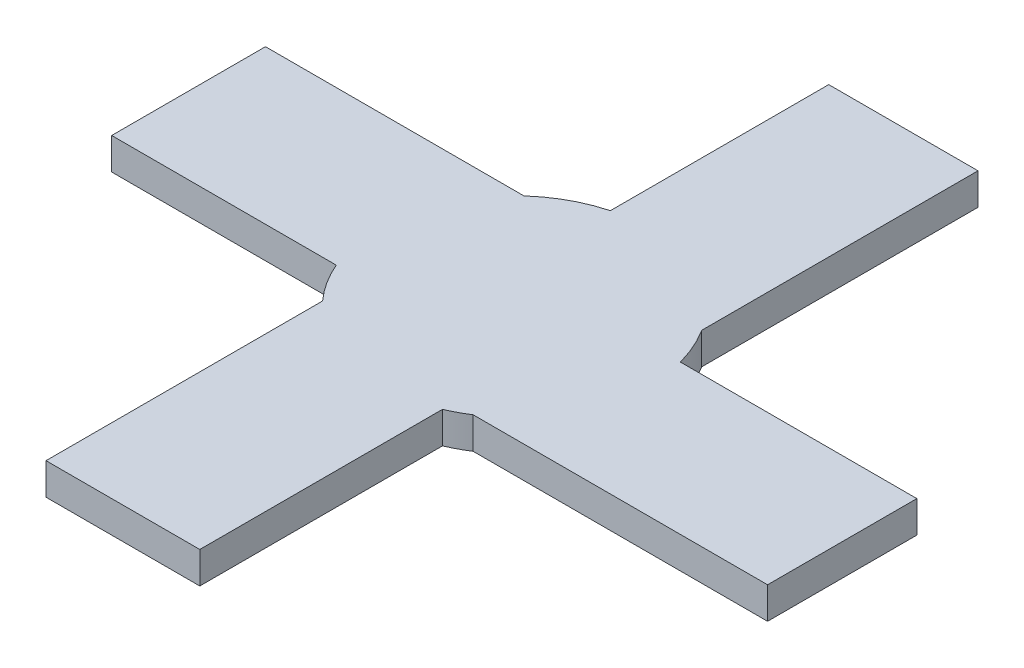
ISO-10303-21;
HEADER;
FILE_DESCRIPTION(('STEP AP214'),'2;1');
FILE_NAME('part.step','',(''),(''),'','','');
FILE_SCHEMA(('AUTOMOTIVE_DESIGN { 1 0 10303 214 1 1 1 1 }'));
ENDSEC;
DATA;
#1=APPLICATION_CONTEXT('core data for automotive mechanical design processes');
#2=APPLICATION_PROTOCOL_DEFINITION('international standard','automotive_design',2000,#1);
#3=PRODUCT_CONTEXT('',#1,'mechanical');
#4=PRODUCT('Part','Part','',(#3));
#5=PRODUCT_RELATED_PRODUCT_CATEGORY('part','',(#4));
#6=PRODUCT_DEFINITION_FORMATION('','',#4);
#7=PRODUCT_DEFINITION_CONTEXT('part definition',#1,'design');
#8=PRODUCT_DEFINITION('design','',#6,#7);
#9=PRODUCT_DEFINITION_SHAPE('','',#8);
#10=(LENGTH_UNIT() NAMED_UNIT(*) SI_UNIT(.MILLI.,.METRE.));
#11=(NAMED_UNIT(*) PLANE_ANGLE_UNIT() SI_UNIT($,.RADIAN.));
#12=(NAMED_UNIT(*) SI_UNIT($,.STERADIAN.) SOLID_ANGLE_UNIT());
#13=UNCERTAINTY_MEASURE_WITH_UNIT(LENGTH_MEASURE(1.E-05),#10,'distance_accuracy_value','');
#14=(GEOMETRIC_REPRESENTATION_CONTEXT(3) GLOBAL_UNCERTAINTY_ASSIGNED_CONTEXT((#13)) GLOBAL_UNIT_ASSIGNED_CONTEXT((#10,
#11,#12)) REPRESENTATION_CONTEXT('',''));
#15=CARTESIAN_POINT('',(0.,0.,0.));
#16=DIRECTION('',(0.,0.,1.));
#17=DIRECTION('',(1.,0.,0.));
#18=AXIS2_PLACEMENT_3D('',#15,#16,#17);
#19=CARTESIAN_POINT('',(-22.26,7.,11.74));
#20=DIRECTION('',(0.,0.,-1.));
#21=DIRECTION('',(-1.,0.,0.));
#22=AXIS2_PLACEMENT_3D('',#19,#20,#21);
#23=PLANE('',#22);
#24=DIRECTION('',(0.,-1.,0.));
#25=VECTOR('',#24,1.);
#26=CARTESIAN_POINT('',(-27.6074700036059,7.,11.74));
#27=LINE('',#26,#25);
#28=CARTESIAN_POINT('',(-27.6074700036059,7.,11.74));
#29=VERTEX_POINT('',#28);
#30=CARTESIAN_POINT('',(-27.6074700036059,0.,11.74));
#31=VERTEX_POINT('',#30);
#32=EDGE_CURVE('E54',#29,#31,#27,.T.);
#33=ORIENTED_EDGE('',*,*,#32,.F.);
#34=DIRECTION('',(1.,0.,0.));
#35=VECTOR('',#34,1.);
#36=CARTESIAN_POINT('',(-22.26,7.,11.74));
#37=LINE('',#36,#35);
#38=CARTESIAN_POINT('',(-77.26,7.,11.74));
#39=VERTEX_POINT('',#38);
#40=EDGE_CURVE('E262',#39,#29,#37,.T.);
#41=ORIENTED_EDGE('',*,*,#40,.F.);
#42=DIRECTION('',(0.,-1.,0.));
#43=VECTOR('',#42,1.);
#44=CARTESIAN_POINT('',(-77.26,7.,11.74));
#45=LINE('',#44,#43);
#46=CARTESIAN_POINT('',(-77.26,0.,11.74));
#47=VERTEX_POINT('',#46);
#48=EDGE_CURVE('E230',#39,#47,#45,.T.);
#49=ORIENTED_EDGE('',*,*,#48,.T.);
#50=DIRECTION('',(1.,0.,0.));
#51=VECTOR('',#50,1.);
#52=CARTESIAN_POINT('',(-22.26,0.,11.74));
#53=LINE('',#52,#51);
#54=EDGE_CURVE('E59',#47,#31,#53,.T.);
#55=ORIENTED_EDGE('',*,*,#54,.T.);
#56=EDGE_LOOP('',(#33,#41,#49,#55));
#57=FACE_BOUND('',#56,.T.);
#58=ADVANCED_FACE('F39',(#57),#23,.F.);
#59=CARTESIAN_POINT('',(-22.26,7.,81.26));
#60=DIRECTION('',(1.,0.,0.));
#61=DIRECTION('',(0.,0.,-1.));
#62=AXIS2_PLACEMENT_3D('',#59,#60,#61);
#63=PLANE('',#62);
#64=DIRECTION('',(0.,-1.,0.));
#65=VECTOR('',#64,1.);
#66=CARTESIAN_POINT('',(-22.26,7.,20.1119964200474));
#67=LINE('',#66,#65);
#68=CARTESIAN_POINT('',(-22.26,0.,20.1119964200474));
#69=VERTEX_POINT('',#68);
#70=CARTESIAN_POINT('',(-22.26,7.,20.1119964200474));
#71=VERTEX_POINT('',#70);
#72=EDGE_CURVE('E343',#69,#71,#67,.F.);
#73=ORIENTED_EDGE('',*,*,#72,.F.);
#74=DIRECTION('',(0.,0.,1.));
#75=VECTOR('',#74,1.);
#76=CARTESIAN_POINT('',(-22.26,0.,81.26));
#77=LINE('',#76,#75);
#78=CARTESIAN_POINT('',(-22.26,0.,81.26));
#79=VERTEX_POINT('',#78);
#80=EDGE_CURVE('E239',#69,#79,#77,.T.);
#81=ORIENTED_EDGE('',*,*,#80,.T.);
#82=DIRECTION('',(0.,-1.,0.));
#83=VECTOR('',#82,1.);
#84=CARTESIAN_POINT('',(-22.26,7.,81.26));
#85=LINE('',#84,#83);
#86=CARTESIAN_POINT('',(-22.26,7.,81.26));
#87=VERTEX_POINT('',#86);
#88=EDGE_CURVE('E47',#87,#79,#85,.T.);
#89=ORIENTED_EDGE('',*,*,#88,.F.);
#90=DIRECTION('',(0.,0.,1.));
#91=VECTOR('',#90,1.);
#92=CARTESIAN_POINT('',(-22.26,7.,81.26));
#93=LINE('',#92,#91);
#94=EDGE_CURVE('E307',#71,#87,#93,.T.);
#95=ORIENTED_EDGE('',*,*,#94,.F.);
#96=EDGE_LOOP('',(#73,#81,#89,#95));
#97=FACE_BOUND('',#96,.T.);
#98=ADVANCED_FACE('F351',(#97),#63,.F.);
#99=CARTESIAN_POINT('',(11.74,7.,25.26));
#100=DIRECTION('',(-1.,0.,0.));
#101=DIRECTION('',(0.,0.,1.));
#102=AXIS2_PLACEMENT_3D('',#99,#100,#101);
#103=PLANE('',#102);
#104=DIRECTION('',(0.,-1.,0.));
#105=VECTOR('',#104,1.);
#106=CARTESIAN_POINT('',(11.74,7.,27.6074700036059));
#107=LINE('',#106,#105);
#108=CARTESIAN_POINT('',(11.74,7.,27.6074700036059));
#109=VERTEX_POINT('',#108);
#110=CARTESIAN_POINT('',(11.74,0.,27.6074700036059));
#111=VERTEX_POINT('',#110);
#112=EDGE_CURVE('E174',#109,#111,#107,.T.);
#113=ORIENTED_EDGE('',*,*,#112,.F.);
#114=DIRECTION('',(0.,0.,-1.));
#115=VECTOR('',#114,1.);
#116=CARTESIAN_POINT('',(11.74,7.,25.26));
#117=LINE('',#116,#115);
#118=CARTESIAN_POINT('',(11.74,7.,81.26));
#119=VERTEX_POINT('',#118);
#120=EDGE_CURVE('E300',#119,#109,#117,.T.);
#121=ORIENTED_EDGE('',*,*,#120,.F.);
#122=DIRECTION('',(0.,-1.,0.));
#123=VECTOR('',#122,1.);
#124=CARTESIAN_POINT('',(11.74,7.,81.26));
#125=LINE('',#124,#123);
#126=CARTESIAN_POINT('',(11.74,0.,81.26));
#127=VERTEX_POINT('',#126);
#128=EDGE_CURVE('E282',#119,#127,#125,.T.);
#129=ORIENTED_EDGE('',*,*,#128,.T.);
#130=DIRECTION('',(0.,0.,-1.));
#131=VECTOR('',#130,1.);
#132=CARTESIAN_POINT('',(11.74,0.,25.26));
#133=LINE('',#132,#131);
#134=EDGE_CURVE('E164',#127,#111,#133,.T.);
#135=ORIENTED_EDGE('',*,*,#134,.T.);
#136=EDGE_LOOP('',(#113,#121,#129,#135));
#137=FACE_BOUND('',#136,.T.);
#138=ADVANCED_FACE('F297',(#137),#103,.F.);
#139=CARTESIAN_POINT('',(81.26,7.,25.26));
#140=DIRECTION('',(0.,0.,-1.));
#141=DIRECTION('',(-1.,0.,0.));
#142=AXIS2_PLACEMENT_3D('',#139,#140,#141);
#143=PLANE('',#142);
#144=DIRECTION('',(0.,-1.,0.));
#145=VECTOR('',#144,1.);
#146=CARTESIAN_POINT('',(16.1843257505526,7.,25.26));
#147=LINE('',#146,#145);
#148=CARTESIAN_POINT('',(16.1843257505526,0.,25.26));
#149=VERTEX_POINT('',#148);
#150=CARTESIAN_POINT('',(16.1843257505526,7.,25.26));
#151=VERTEX_POINT('',#150);
#152=EDGE_CURVE('E167',#149,#151,#147,.F.);
#153=ORIENTED_EDGE('',*,*,#152,.F.);
#154=DIRECTION('',(1.,0.,0.));
#155=VECTOR('',#154,1.);
#156=CARTESIAN_POINT('',(81.26,0.,25.26));
#157=LINE('',#156,#155);
#158=CARTESIAN_POINT('',(81.26,0.,25.26));
#159=VERTEX_POINT('',#158);
#160=EDGE_CURVE('E152',#149,#159,#157,.T.);
#161=ORIENTED_EDGE('',*,*,#160,.T.);
#162=DIRECTION('',(0.,-1.,0.));
#163=VECTOR('',#162,1.);
#164=CARTESIAN_POINT('',(81.26,7.,25.26));
#165=LINE('',#164,#163);
#166=CARTESIAN_POINT('',(81.26,7.,25.26));
#167=VERTEX_POINT('',#166);
#168=EDGE_CURVE('E279',#167,#159,#165,.T.);
#169=ORIENTED_EDGE('',*,*,#168,.F.);
#170=DIRECTION('',(1.,0.,0.));
#171=VECTOR('',#170,1.);
#172=CARTESIAN_POINT('',(81.26,7.,25.26));
#173=LINE('',#172,#171);
#174=EDGE_CURVE('E169',#151,#167,#173,.T.);
#175=ORIENTED_EDGE('',*,*,#174,.F.);
#176=EDGE_LOOP('',(#153,#161,#169,#175));
#177=FACE_BOUND('',#176,.T.);
#178=ADVANCED_FACE('F168',(#177),#143,.F.);
#179=CARTESIAN_POINT('',(25.26,7.,-7.74));
#180=DIRECTION('',(0.,0.,1.));
#181=DIRECTION('',(1.,0.,0.));
#182=AXIS2_PLACEMENT_3D('',#179,#180,#181);
#183=PLANE('',#182);
#184=DIRECTION('',(0.,-1.,0.));
#185=VECTOR('',#184,1.);
#186=CARTESIAN_POINT('',(28.984347499987,7.,-7.74));
#187=LINE('',#186,#185);
#188=CARTESIAN_POINT('',(28.984347499987,7.,-7.74));
#189=VERTEX_POINT('',#188);
#190=CARTESIAN_POINT('',(28.984347499987,0.,-7.74));
#191=VERTEX_POINT('',#190);
#192=EDGE_CURVE('E175',#189,#191,#187,.T.);
#193=ORIENTED_EDGE('',*,*,#192,.F.);
#194=DIRECTION('',(-1.,0.,0.));
#195=VECTOR('',#194,1.);
#196=CARTESIAN_POINT('',(25.26,7.,-7.74));
#197=LINE('',#196,#195);
#198=CARTESIAN_POINT('',(81.26,7.,-7.74));
#199=VERTEX_POINT('',#198);
#200=EDGE_CURVE('E313',#199,#189,#197,.T.);
#201=ORIENTED_EDGE('',*,*,#200,.F.);
#202=DIRECTION('',(0.,-1.,0.));
#203=VECTOR('',#202,1.);
#204=CARTESIAN_POINT('',(81.26,7.,-7.74));
#205=LINE('',#204,#203);
#206=CARTESIAN_POINT('',(81.26,0.,-7.74));
#207=VERTEX_POINT('',#206);
#208=EDGE_CURVE('E275',#199,#207,#205,.T.);
#209=ORIENTED_EDGE('',*,*,#208,.T.);
#210=DIRECTION('',(-1.,0.,0.));
#211=VECTOR('',#210,1.);
#212=CARTESIAN_POINT('',(25.26,0.,-7.74));
#213=LINE('',#212,#211);
#214=EDGE_CURVE('E249',#207,#191,#213,.T.);
#215=ORIENTED_EDGE('',*,*,#214,.T.);
#216=EDGE_LOOP('',(#193,#201,#209,#215));
#217=FACE_BOUND('',#216,.T.);
#218=ADVANCED_FACE('F376',(#217),#183,.F.);
#219=CARTESIAN_POINT('',(25.26,7.,-77.26));
#220=DIRECTION('',(-1.,0.,0.));
#221=DIRECTION('',(0.,0.,1.));
#222=AXIS2_PLACEMENT_3D('',#219,#220,#221);
#223=PLANE('',#222);
#224=DIRECTION('',(0.,-1.,0.));
#225=VECTOR('',#224,1.);
#226=CARTESIAN_POINT('',(25.26,7.,-16.1843257505526));
#227=LINE('',#226,#225);
#228=CARTESIAN_POINT('',(25.26,0.,-16.1843257505526));
#229=VERTEX_POINT('',#228);
#230=CARTESIAN_POINT('',(25.26,7.,-16.1843257505526));
#231=VERTEX_POINT('',#230);
#232=EDGE_CURVE('E331',#229,#231,#227,.F.);
#233=ORIENTED_EDGE('',*,*,#232,.F.);
#234=DIRECTION('',(0.,0.,-1.));
#235=VECTOR('',#234,1.);
#236=CARTESIAN_POINT('',(25.26,0.,-77.26));
#237=LINE('',#236,#235);
#238=CARTESIAN_POINT('',(25.26,0.,-77.26));
#239=VERTEX_POINT('',#238);
#240=EDGE_CURVE('E252',#229,#239,#237,.T.);
#241=ORIENTED_EDGE('',*,*,#240,.T.);
#242=DIRECTION('',(0.,-1.,0.));
#243=VECTOR('',#242,1.);
#244=CARTESIAN_POINT('',(25.26,7.,-77.26));
#245=LINE('',#244,#243);
#246=CARTESIAN_POINT('',(25.26,7.,-77.26));
#247=VERTEX_POINT('',#246);
#248=EDGE_CURVE('E271',#247,#239,#245,.T.);
#249=ORIENTED_EDGE('',*,*,#248,.F.);
#250=DIRECTION('',(0.,0.,-1.));
#251=VECTOR('',#250,1.);
#252=CARTESIAN_POINT('',(25.26,7.,-77.26));
#253=LINE('',#252,#251);
#254=EDGE_CURVE('E317',#231,#247,#253,.T.);
#255=ORIENTED_EDGE('',*,*,#254,.F.);
#256=EDGE_LOOP('',(#233,#241,#249,#255));
#257=FACE_BOUND('',#256,.T.);
#258=ADVANCED_FACE('F382',(#257),#223,.F.);
#259=CARTESIAN_POINT('',(-7.74,7.,-22.26));
#260=DIRECTION('',(1.,0.,0.));
#261=DIRECTION('',(0.,0.,-1.));
#262=AXIS2_PLACEMENT_3D('',#259,#260,#261);
#263=PLANE('',#262);
#264=DIRECTION('',(0.,-1.,0.));
#265=VECTOR('',#264,1.);
#266=CARTESIAN_POINT('',(-7.74,7.,-28.984347499987));
#267=LINE('',#266,#265);
#268=CARTESIAN_POINT('',(-7.74,7.,-28.984347499987));
#269=VERTEX_POINT('',#268);
#270=CARTESIAN_POINT('',(-7.74,0.,-28.984347499987));
#271=VERTEX_POINT('',#270);
#272=EDGE_CURVE('E207',#269,#271,#267,.T.);
#273=ORIENTED_EDGE('',*,*,#272,.F.);
#274=DIRECTION('',(0.,0.,1.));
#275=VECTOR('',#274,1.);
#276=CARTESIAN_POINT('',(-7.74,7.,-22.26));
#277=LINE('',#276,#275);
#278=CARTESIAN_POINT('',(-7.74,7.,-77.26));
#279=VERTEX_POINT('',#278);
#280=EDGE_CURVE('E226',#279,#269,#277,.T.);
#281=ORIENTED_EDGE('',*,*,#280,.F.);
#282=DIRECTION('',(0.,-1.,0.));
#283=VECTOR('',#282,1.);
#284=CARTESIAN_POINT('',(-7.74,7.,-77.26));
#285=LINE('',#284,#283);
#286=CARTESIAN_POINT('',(-7.74,0.,-77.26));
#287=VERTEX_POINT('',#286);
#288=EDGE_CURVE('E267',#279,#287,#285,.T.);
#289=ORIENTED_EDGE('',*,*,#288,.T.);
#290=DIRECTION('',(0.,0.,1.));
#291=VECTOR('',#290,1.);
#292=CARTESIAN_POINT('',(-7.74,0.,-22.26));
#293=LINE('',#292,#291);
#294=EDGE_CURVE('E210',#287,#271,#293,.T.);
#295=ORIENTED_EDGE('',*,*,#294,.T.);
#296=EDGE_LOOP('',(#273,#281,#289,#295));
#297=FACE_BOUND('',#296,.T.);
#298=ADVANCED_FACE('F329',(#297),#263,.F.);
#299=CARTESIAN_POINT('',(-77.26,7.,-22.26));
#300=DIRECTION('',(0.,0.,1.));
#301=DIRECTION('',(1.,0.,0.));
#302=AXIS2_PLACEMENT_3D('',#299,#300,#301);
#303=PLANE('',#302);
#304=DIRECTION('',(0.,-1.,0.));
#305=VECTOR('',#304,1.);
#306=CARTESIAN_POINT('',(-20.1119964200474,7.,-22.26));
#307=LINE('',#306,#305);
#308=CARTESIAN_POINT('',(-20.1119964200474,0.,-22.26));
#309=VERTEX_POINT('',#308);
#310=CARTESIAN_POINT('',(-20.1119964200474,7.,-22.26));
#311=VERTEX_POINT('',#310);
#312=EDGE_CURVE('E11',#309,#311,#307,.F.);
#313=ORIENTED_EDGE('',*,*,#312,.F.);
#314=DIRECTION('',(-1.,0.,0.));
#315=VECTOR('',#314,1.);
#316=CARTESIAN_POINT('',(-77.26,0.,-22.26));
#317=LINE('',#316,#315);
#318=CARTESIAN_POINT('',(-77.26,0.,-22.26));
#319=VERTEX_POINT('',#318);
#320=EDGE_CURVE('E212',#309,#319,#317,.T.);
#321=ORIENTED_EDGE('',*,*,#320,.T.);
#322=DIRECTION('',(0.,-1.,0.));
#323=VECTOR('',#322,1.);
#324=CARTESIAN_POINT('',(-77.26,7.,-22.26));
#325=LINE('',#324,#323);
#326=CARTESIAN_POINT('',(-77.26,7.,-22.26));
#327=VERTEX_POINT('',#326);
#328=EDGE_CURVE('E221',#327,#319,#325,.T.);
#329=ORIENTED_EDGE('',*,*,#328,.F.);
#330=DIRECTION('',(-1.,0.,0.));
#331=VECTOR('',#330,1.);
#332=CARTESIAN_POINT('',(-77.26,7.,-22.26));
#333=LINE('',#332,#331);
#334=EDGE_CURVE('E220',#311,#327,#333,.T.);
#335=ORIENTED_EDGE('',*,*,#334,.F.);
#336=EDGE_LOOP('',(#313,#321,#329,#335));
#337=FACE_BOUND('',#336,.T.);
#338=ADVANCED_FACE('F219',(#337),#303,.F.);
#339=CARTESIAN_POINT('',(0.,7.,0.));
#340=DIRECTION('',(0.,-1.,0.));
#341=DIRECTION('',(0.,0.,-1.));
#342=AXIS2_PLACEMENT_3D('',#339,#340,#341);
#343=PLANE('',#342);
#344=ORIENTED_EDGE('',*,*,#280,.T.);
#345=CARTESIAN_POINT('',(0.,7.,0.));
#346=DIRECTION('',(0.,1.,0.));
#347=DIRECTION('',(0.,0.,1.));
#348=AXIS2_PLACEMENT_3D('',#345,#346,#347);
#349=CIRCLE('',#348,30.);
#350=EDGE_CURVE('E187',#269,#311,#349,.T.);
#351=ORIENTED_EDGE('',*,*,#350,.T.);
#352=ORIENTED_EDGE('',*,*,#334,.T.);
#353=DIRECTION('',(0.,0.,1.));
#354=VECTOR('',#353,1.);
#355=CARTESIAN_POINT('',(-77.26,7.,11.74));
#356=LINE('',#355,#354);
#357=EDGE_CURVE('E225',#327,#39,#356,.T.);
#358=ORIENTED_EDGE('',*,*,#357,.T.);
#359=ORIENTED_EDGE('',*,*,#40,.T.);
#360=EDGE_CURVE('E180',#29,#71,#349,.T.);
#361=ORIENTED_EDGE('',*,*,#360,.T.);
#362=ORIENTED_EDGE('',*,*,#94,.T.);
#363=DIRECTION('',(1.,0.,0.));
#364=VECTOR('',#363,1.);
#365=CARTESIAN_POINT('',(11.74,7.,81.26));
#366=LINE('',#365,#364);
#367=EDGE_CURVE('E293',#87,#119,#366,.T.);
#368=ORIENTED_EDGE('',*,*,#367,.T.);
#369=ORIENTED_EDGE('',*,*,#120,.T.);
#370=EDGE_CURVE('E189',#109,#151,#349,.T.);
#371=ORIENTED_EDGE('',*,*,#370,.T.);
#372=ORIENTED_EDGE('',*,*,#174,.T.);
#373=DIRECTION('',(0.,0.,-1.));
#374=VECTOR('',#373,1.);
#375=CARTESIAN_POINT('',(81.26,7.,-7.74));
#376=LINE('',#375,#374);
#377=EDGE_CURVE('E305',#167,#199,#376,.T.);
#378=ORIENTED_EDGE('',*,*,#377,.T.);
#379=ORIENTED_EDGE('',*,*,#200,.T.);
#380=EDGE_CURVE('E336',#189,#231,#349,.T.);
#381=ORIENTED_EDGE('',*,*,#380,.T.);
#382=ORIENTED_EDGE('',*,*,#254,.T.);
#383=DIRECTION('',(-1.,0.,0.));
#384=VECTOR('',#383,1.);
#385=CARTESIAN_POINT('',(-7.74,7.,-77.26));
#386=LINE('',#385,#384);
#387=EDGE_CURVE('E233',#247,#279,#386,.T.);
#388=ORIENTED_EDGE('',*,*,#387,.T.);
#389=EDGE_LOOP('',(#344,#351,#352,#358,#359,#361,#362,#368,#369,#371,#372,#378,#379,#381,#382,#388));
#390=FACE_BOUND('',#389,.T.);
#391=ADVANCED_FACE('F322',(#390),#343,.F.);
#392=CARTESIAN_POINT('',(0.,0.,0.));
#393=DIRECTION('',(0.,-1.,0.));
#394=DIRECTION('',(0.,0.,-1.));
#395=AXIS2_PLACEMENT_3D('',#392,#393,#394);
#396=PLANE('',#395);
#397=ORIENTED_EDGE('',*,*,#240,.F.);
#398=CARTESIAN_POINT('',(0.,0.,0.));
#399=DIRECTION('',(0.,1.,0.));
#400=DIRECTION('',(0.,0.,1.));
#401=AXIS2_PLACEMENT_3D('',#398,#399,#400);
#402=CIRCLE('',#401,30.);
#403=EDGE_CURVE('E181',#191,#229,#402,.T.);
#404=ORIENTED_EDGE('',*,*,#403,.F.);
#405=ORIENTED_EDGE('',*,*,#214,.F.);
#406=DIRECTION('',(0.,0.,-1.));
#407=VECTOR('',#406,1.);
#408=CARTESIAN_POINT('',(81.26,0.,-7.74));
#409=LINE('',#408,#407);
#410=EDGE_CURVE('E159',#159,#207,#409,.T.);
#411=ORIENTED_EDGE('',*,*,#410,.F.);
#412=ORIENTED_EDGE('',*,*,#160,.F.);
#413=EDGE_CURVE('E157',#111,#149,#402,.T.);
#414=ORIENTED_EDGE('',*,*,#413,.F.);
#415=ORIENTED_EDGE('',*,*,#134,.F.);
#416=DIRECTION('',(1.,0.,0.));
#417=VECTOR('',#416,1.);
#418=CARTESIAN_POINT('',(11.74,0.,81.26));
#419=LINE('',#418,#417);
#420=EDGE_CURVE('E242',#79,#127,#419,.T.);
#421=ORIENTED_EDGE('',*,*,#420,.F.);
#422=ORIENTED_EDGE('',*,*,#80,.F.);
#423=EDGE_CURVE('E183',#31,#69,#402,.T.);
#424=ORIENTED_EDGE('',*,*,#423,.F.);
#425=ORIENTED_EDGE('',*,*,#54,.F.);
#426=DIRECTION('',(0.,0.,1.));
#427=VECTOR('',#426,1.);
#428=CARTESIAN_POINT('',(-77.26,0.,11.74));
#429=LINE('',#428,#427);
#430=EDGE_CURVE('E213',#319,#47,#429,.T.);
#431=ORIENTED_EDGE('',*,*,#430,.F.);
#432=ORIENTED_EDGE('',*,*,#320,.F.);
#433=EDGE_CURVE('E191',#271,#309,#402,.T.);
#434=ORIENTED_EDGE('',*,*,#433,.F.);
#435=ORIENTED_EDGE('',*,*,#294,.F.);
#436=DIRECTION('',(-1.,0.,0.));
#437=VECTOR('',#436,1.);
#438=CARTESIAN_POINT('',(-7.74,0.,-77.26));
#439=LINE('',#438,#437);
#440=EDGE_CURVE('E255',#239,#287,#439,.T.);
#441=ORIENTED_EDGE('',*,*,#440,.F.);
#442=EDGE_LOOP('',(#397,#404,#405,#411,#412,#414,#415,#421,#422,#424,#425,#431,#432,#434,#435,#441));
#443=FACE_BOUND('',#442,.T.);
#444=ADVANCED_FACE('F154',(#443),#396,.T.);
#445=CARTESIAN_POINT('',(11.74,7.,81.26));
#446=DIRECTION('',(0.,0.,-1.));
#447=DIRECTION('',(-1.,0.,0.));
#448=AXIS2_PLACEMENT_3D('',#445,#446,#447);
#449=PLANE('',#448);
#450=ORIENTED_EDGE('',*,*,#420,.T.);
#451=ORIENTED_EDGE('',*,*,#128,.F.);
#452=ORIENTED_EDGE('',*,*,#367,.F.);
#453=ORIENTED_EDGE('',*,*,#88,.T.);
#454=EDGE_LOOP('',(#450,#451,#452,#453));
#455=FACE_BOUND('',#454,.T.);
#456=ADVANCED_FACE('F291',(#455),#449,.F.);
#457=CARTESIAN_POINT('',(81.26,7.,-7.74));
#458=DIRECTION('',(-1.,0.,0.));
#459=DIRECTION('',(0.,0.,1.));
#460=AXIS2_PLACEMENT_3D('',#457,#458,#459);
#461=PLANE('',#460);
#462=ORIENTED_EDGE('',*,*,#410,.T.);
#463=ORIENTED_EDGE('',*,*,#208,.F.);
#464=ORIENTED_EDGE('',*,*,#377,.F.);
#465=ORIENTED_EDGE('',*,*,#168,.T.);
#466=EDGE_LOOP('',(#462,#463,#464,#465));
#467=FACE_BOUND('',#466,.T.);
#468=ADVANCED_FACE('F372',(#467),#461,.F.);
#469=CARTESIAN_POINT('',(-7.74,7.,-77.26));
#470=DIRECTION('',(0.,0.,1.));
#471=DIRECTION('',(1.,0.,0.));
#472=AXIS2_PLACEMENT_3D('',#469,#470,#471);
#473=PLANE('',#472);
#474=ORIENTED_EDGE('',*,*,#440,.T.);
#475=ORIENTED_EDGE('',*,*,#288,.F.);
#476=ORIENTED_EDGE('',*,*,#387,.F.);
#477=ORIENTED_EDGE('',*,*,#248,.T.);
#478=EDGE_LOOP('',(#474,#475,#476,#477));
#479=FACE_BOUND('',#478,.T.);
#480=ADVANCED_FACE('F327',(#479),#473,.F.);
#481=CARTESIAN_POINT('',(-77.26,7.,11.74));
#482=DIRECTION('',(1.,0.,0.));
#483=DIRECTION('',(0.,0.,-1.));
#484=AXIS2_PLACEMENT_3D('',#481,#482,#483);
#485=PLANE('',#484);
#486=ORIENTED_EDGE('',*,*,#430,.T.);
#487=ORIENTED_EDGE('',*,*,#48,.F.);
#488=ORIENTED_EDGE('',*,*,#357,.F.);
#489=ORIENTED_EDGE('',*,*,#328,.T.);
#490=EDGE_LOOP('',(#486,#487,#488,#489));
#491=FACE_BOUND('',#490,.T.);
#492=ADVANCED_FACE('F361',(#491),#485,.F.);
#493=CARTESIAN_POINT('',(0.,7.,0.));
#494=DIRECTION('',(0.,-1.,0.));
#495=DIRECTION('',(0.,0.,-1.));
#496=AXIS2_PLACEMENT_3D('',#493,#494,#495);
#497=CYLINDRICAL_SURFACE('',#496,30.);
#498=ORIENTED_EDGE('',*,*,#350,.F.);
#499=ORIENTED_EDGE('',*,*,#272,.T.);
#500=ORIENTED_EDGE('',*,*,#433,.T.);
#501=ORIENTED_EDGE('',*,*,#312,.T.);
#502=EDGE_LOOP('',(#498,#499,#500,#501));
#503=FACE_BOUND('',#502,.T.);
#504=ADVANCED_FACE('F204',(#503),#497,.T.);
#505=ORIENTED_EDGE('',*,*,#380,.F.);
#506=ORIENTED_EDGE('',*,*,#192,.T.);
#507=ORIENTED_EDGE('',*,*,#403,.T.);
#508=ORIENTED_EDGE('',*,*,#232,.T.);
#509=EDGE_LOOP('',(#505,#506,#507,#508));
#510=FACE_BOUND('',#509,.T.);
#511=ADVANCED_FACE('F358',(#510),#497,.T.);
#512=ORIENTED_EDGE('',*,*,#370,.F.);
#513=ORIENTED_EDGE('',*,*,#112,.T.);
#514=ORIENTED_EDGE('',*,*,#413,.T.);
#515=ORIENTED_EDGE('',*,*,#152,.T.);
#516=EDGE_LOOP('',(#512,#513,#514,#515));
#517=FACE_BOUND('',#516,.T.);
#518=ADVANCED_FACE('F178',(#517),#497,.T.);
#519=ORIENTED_EDGE('',*,*,#360,.F.);
#520=ORIENTED_EDGE('',*,*,#32,.T.);
#521=ORIENTED_EDGE('',*,*,#423,.T.);
#522=ORIENTED_EDGE('',*,*,#72,.T.);
#523=EDGE_LOOP('',(#519,#520,#521,#522));
#524=FACE_BOUND('',#523,.T.);
#525=ADVANCED_FACE('F352',(#524),#497,.T.);
#526=CLOSED_SHELL('',(#58,#98,#138,#178,#218,#258,#298,#338,#391,#444,#456,#468,#480,#492,#504,
#511,#518,#525));
#527=MANIFOLD_SOLID_BREP('B2',#526);
#528=ADVANCED_BREP_SHAPE_REPRESENTATION('',(#18,#527),#14);
#529=SHAPE_DEFINITION_REPRESENTATION(#9,#528);
ENDSEC;
END-ISO-10303-21;
